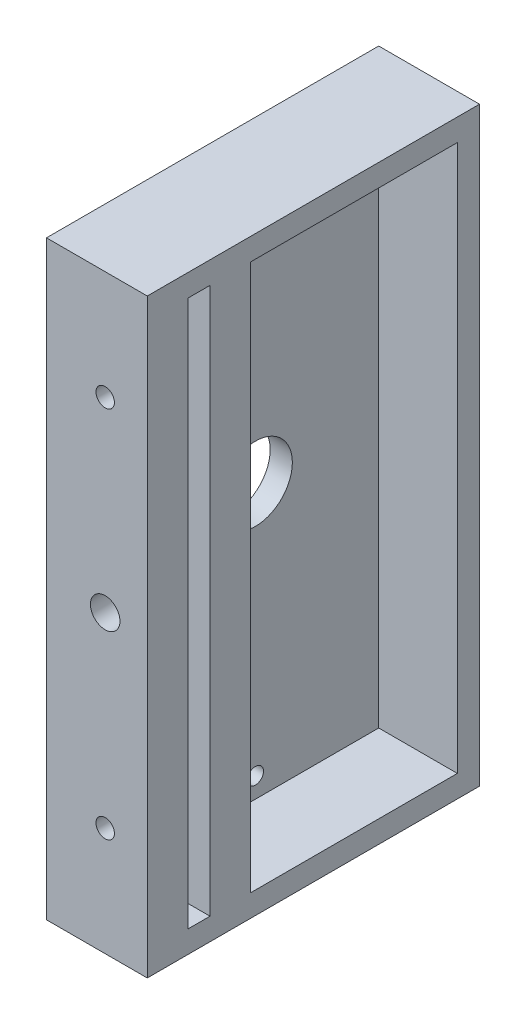
ISO-10303-21;
HEADER;
FILE_DESCRIPTION(('STEP AP214'),'2;1');
FILE_NAME('part.step','',(''),(''),'','','');
FILE_SCHEMA(('AUTOMOTIVE_DESIGN { 1 0 10303 214 1 1 1 1 }'));
ENDSEC;
DATA;
#1=APPLICATION_CONTEXT('core data for automotive mechanical design processes');
#2=APPLICATION_PROTOCOL_DEFINITION('international standard','automotive_design',2000,#1);
#3=PRODUCT_CONTEXT('',#1,'mechanical');
#4=PRODUCT('Part','Part','',(#3));
#5=PRODUCT_RELATED_PRODUCT_CATEGORY('part','',(#4));
#6=PRODUCT_DEFINITION_FORMATION('','',#4);
#7=PRODUCT_DEFINITION_CONTEXT('part definition',#1,'design');
#8=PRODUCT_DEFINITION('design','',#6,#7);
#9=PRODUCT_DEFINITION_SHAPE('','',#8);
#10=(LENGTH_UNIT() NAMED_UNIT(*) SI_UNIT(.MILLI.,.METRE.));
#11=(NAMED_UNIT(*) PLANE_ANGLE_UNIT() SI_UNIT($,.RADIAN.));
#12=(NAMED_UNIT(*) SI_UNIT($,.STERADIAN.) SOLID_ANGLE_UNIT());
#13=UNCERTAINTY_MEASURE_WITH_UNIT(LENGTH_MEASURE(1.E-05),#10,'distance_accuracy_value','');
#14=(GEOMETRIC_REPRESENTATION_CONTEXT(3) GLOBAL_UNCERTAINTY_ASSIGNED_CONTEXT((#13)) GLOBAL_UNIT_ASSIGNED_CONTEXT((#10,
#11,#12)) REPRESENTATION_CONTEXT('',''));
#15=CARTESIAN_POINT('',(0.,0.,0.));
#16=DIRECTION('',(0.,0.,1.));
#17=DIRECTION('',(1.,0.,0.));
#18=AXIS2_PLACEMENT_3D('',#15,#16,#17);
#19=CARTESIAN_POINT('',(0.,80.,9.50197166325664));
#20=DIRECTION('',(0.,0.,-1.));
#21=DIRECTION('',(-1.,0.,0.));
#22=AXIS2_PLACEMENT_3D('',#19,#20,#21);
#23=PLANE('',#22);
#24=CARTESIAN_POINT('',(7.66040087296786,65.2737580008136,9.50197166325664));
#25=DIRECTION('',(0.,0.,-1.));
#26=DIRECTION('',(-1.,0.,0.));
#27=AXIS2_PLACEMENT_3D('',#24,#25,#26);
#28=CIRCLE('',#27,1.25);
#29=CARTESIAN_POINT('',(6.41040087296786,65.2737580008136,9.50197166325664));
#30=VERTEX_POINT('',#29);
#31=EDGE_CURVE('E211',#30,#30,#28,.T.);
#32=ORIENTED_EDGE('',*,*,#31,.T.);
#33=EDGE_LOOP('',(#32));
#34=FACE_BOUND('',#33,.T.);
#35=CARTESIAN_POINT('',(7.66040087296786,40.,9.50197166325664));
#36=DIRECTION('',(0.,0.,-1.));
#37=DIRECTION('',(-1.,0.,0.));
#38=AXIS2_PLACEMENT_3D('',#35,#36,#37);
#39=CIRCLE('',#38,2.);
#40=CARTESIAN_POINT('',(5.66040087296786,40.,9.50197166325664));
#41=VERTEX_POINT('',#40);
#42=EDGE_CURVE('E197',#41,#41,#39,.T.);
#43=ORIENTED_EDGE('',*,*,#42,.T.);
#44=EDGE_LOOP('',(#43));
#45=FACE_BOUND('',#44,.T.);
#46=CARTESIAN_POINT('',(7.66040087296786,14.7262419991864,9.50197166325664));
#47=DIRECTION('',(0.,0.,-1.));
#48=DIRECTION('',(-1.,0.,0.));
#49=AXIS2_PLACEMENT_3D('',#46,#47,#48);
#50=CIRCLE('',#49,1.25);
#51=CARTESIAN_POINT('',(6.41040087296786,14.7262419991864,9.50197166325664));
#52=VERTEX_POINT('',#51);
#53=EDGE_CURVE('E201',#52,#52,#50,.T.);
#54=ORIENTED_EDGE('',*,*,#53,.T.);
#55=EDGE_LOOP('',(#54));
#56=FACE_BOUND('',#55,.T.);
#57=DIRECTION('',(-1.,0.,0.));
#58=VECTOR('',#57,1.);
#59=CARTESIAN_POINT('',(0.,3.,9.50197166325664));
#60=LINE('',#59,#58);
#61=CARTESIAN_POINT('',(13.3604008729679,3.,9.50197166325664));
#62=VERTEX_POINT('',#61);
#63=CARTESIAN_POINT('',(2.71072157317264,3.,9.50197166325664));
#64=VERTEX_POINT('',#63);
#65=EDGE_CURVE('E171',#62,#64,#60,.T.);
#66=ORIENTED_EDGE('',*,*,#65,.F.);
#67=DIRECTION('',(0.,-1.,0.));
#68=VECTOR('',#67,1.);
#69=CARTESIAN_POINT('',(13.3604008729679,80.,9.50197166325664));
#70=LINE('',#69,#68);
#71=CARTESIAN_POINT('',(13.3604008729679,77.,9.50197166325664));
#72=VERTEX_POINT('',#71);
#73=EDGE_CURVE('E11',#72,#62,#70,.T.);
#74=ORIENTED_EDGE('',*,*,#73,.F.);
#75=DIRECTION('',(-1.,0.,0.));
#76=VECTOR('',#75,1.);
#77=CARTESIAN_POINT('',(0.,77.,9.50197166325664));
#78=LINE('',#77,#76);
#79=CARTESIAN_POINT('',(2.71072157317264,77.,9.50197166325664));
#80=VERTEX_POINT('',#79);
#81=EDGE_CURVE('E165',#72,#80,#78,.T.);
#82=ORIENTED_EDGE('',*,*,#81,.T.);
#83=DIRECTION('',(0.,-1.,0.));
#84=VECTOR('',#83,1.);
#85=CARTESIAN_POINT('',(2.71072157317264,80.,9.50197166325664));
#86=LINE('',#85,#84);
#87=EDGE_CURVE('E226',#80,#64,#86,.T.);
#88=ORIENTED_EDGE('',*,*,#87,.T.);
#89=EDGE_LOOP('',(#66,#74,#82,#88));
#90=FACE_BOUND('',#89,.T.);
#91=ADVANCED_FACE('F34',(#34,#45,#56,#90),#23,.F.);
#92=CARTESIAN_POINT('',(0.,80.,4.00197166325664));
#93=DIRECTION('',(0.,0.,-1.));
#94=DIRECTION('',(-1.,0.,0.));
#95=AXIS2_PLACEMENT_3D('',#92,#93,#94);
#96=PLANE('',#95);
#97=CARTESIAN_POINT('',(7.66040087296786,14.7262419991864,4.00197166325664));
#98=DIRECTION('',(0.,0.,-1.));
#99=DIRECTION('',(1.,0.,0.));
#100=AXIS2_PLACEMENT_3D('',#97,#98,#99);
#101=CIRCLE('',#100,1.25);
#102=CARTESIAN_POINT('',(8.91040087296787,14.7262419991864,4.00197166325664));
#103=VERTEX_POINT('',#102);
#104=EDGE_CURVE('E188',#103,#103,#101,.T.);
#105=ORIENTED_EDGE('',*,*,#104,.F.);
#106=EDGE_LOOP('',(#105));
#107=FACE_BOUND('',#106,.T.);
#108=CARTESIAN_POINT('',(7.66040087296786,40.,4.00197166325664));
#109=DIRECTION('',(0.,0.,-1.));
#110=DIRECTION('',(-1.,0.,0.));
#111=AXIS2_PLACEMENT_3D('',#108,#109,#110);
#112=CIRCLE('',#111,2.);
#113=CARTESIAN_POINT('',(5.66040087296786,40.,4.00197166325664));
#114=VERTEX_POINT('',#113);
#115=EDGE_CURVE('E194',#114,#114,#112,.T.);
#116=ORIENTED_EDGE('',*,*,#115,.F.);
#117=EDGE_LOOP('',(#116));
#118=FACE_BOUND('',#117,.T.);
#119=CARTESIAN_POINT('',(7.66040087296786,65.2737580008136,4.00197166325664));
#120=DIRECTION('',(0.,0.,-1.));
#121=DIRECTION('',(-1.,0.,0.));
#122=AXIS2_PLACEMENT_3D('',#119,#120,#121);
#123=CIRCLE('',#122,1.25);
#124=CARTESIAN_POINT('',(6.41040087296786,65.2737580008136,4.00197166325664));
#125=VERTEX_POINT('',#124);
#126=EDGE_CURVE('E204',#125,#125,#123,.T.);
#127=ORIENTED_EDGE('',*,*,#126,.F.);
#128=EDGE_LOOP('',(#127));
#129=FACE_BOUND('',#128,.T.);
#130=DIRECTION('',(0.,-1.,0.));
#131=VECTOR('',#130,1.);
#132=CARTESIAN_POINT('',(13.3604008729679,80.,4.00197166325664));
#133=LINE('',#132,#131);
#134=CARTESIAN_POINT('',(13.3604008729679,77.,4.00197166325664));
#135=VERTEX_POINT('',#134);
#136=CARTESIAN_POINT('',(13.3604008729679,3.,4.00197166325664));
#137=VERTEX_POINT('',#136);
#138=EDGE_CURVE('E42',#135,#137,#133,.T.);
#139=ORIENTED_EDGE('',*,*,#138,.T.);
#140=DIRECTION('',(-1.,0.,0.));
#141=VECTOR('',#140,1.);
#142=CARTESIAN_POINT('',(0.,3.,4.00197166325664));
#143=LINE('',#142,#141);
#144=CARTESIAN_POINT('',(2.71072157317264,3.,4.00197166325664));
#145=VERTEX_POINT('',#144);
#146=EDGE_CURVE('E168',#137,#145,#143,.T.);
#147=ORIENTED_EDGE('',*,*,#146,.T.);
#148=DIRECTION('',(0.,-1.,0.));
#149=VECTOR('',#148,1.);
#150=CARTESIAN_POINT('',(2.71072157317264,80.,4.00197166325664));
#151=LINE('',#150,#149);
#152=CARTESIAN_POINT('',(2.71072157317264,77.,4.00197166325664));
#153=VERTEX_POINT('',#152);
#154=EDGE_CURVE('E249',#153,#145,#151,.T.);
#155=ORIENTED_EDGE('',*,*,#154,.F.);
#156=DIRECTION('',(-1.,0.,0.));
#157=VECTOR('',#156,1.);
#158=CARTESIAN_POINT('',(0.,77.,4.00197166325664));
#159=LINE('',#158,#157);
#160=EDGE_CURVE('E142',#135,#153,#159,.T.);
#161=ORIENTED_EDGE('',*,*,#160,.F.);
#162=EDGE_LOOP('',(#139,#147,#155,#161));
#163=FACE_BOUND('',#162,.T.);
#164=ADVANCED_FACE('F286',(#107,#118,#129,#163),#96,.T.);
#165=CARTESIAN_POINT('',(2.71072157317264,80.,0.));
#166=DIRECTION('',(1.,0.,0.));
#167=DIRECTION('',(0.,0.,-1.));
#168=AXIS2_PLACEMENT_3D('',#165,#166,#167);
#169=PLANE('',#168);
#170=CARTESIAN_POINT('',(2.71072157317264,74.25,-7.29802833674336));
#171=DIRECTION('',(1.,0.,0.));
#172=DIRECTION('',(0.,0.,-1.));
#173=AXIS2_PLACEMENT_3D('',#170,#171,#172);
#174=CIRCLE('',#173,1.0922);
#175=CARTESIAN_POINT('',(2.71072157317264,74.25,-8.39022833674336));
#176=VERTEX_POINT('',#175);
#177=EDGE_CURVE('E174',#176,#176,#174,.T.);
#178=ORIENTED_EDGE('',*,*,#177,.F.);
#179=EDGE_LOOP('',(#178));
#180=FACE_BOUND('',#179,.T.);
#181=CARTESIAN_POINT('',(2.71072157317264,5.74999999999999,-7.29802833674336));
#182=DIRECTION('',(1.,0.,0.));
#183=DIRECTION('',(0.,0.,1.));
#184=AXIS2_PLACEMENT_3D('',#181,#182,#183);
#185=CIRCLE('',#184,1.0922);
#186=CARTESIAN_POINT('',(2.71072157317264,5.74999999999999,-6.20582833674336));
#187=VERTEX_POINT('',#186);
#188=EDGE_CURVE('E173',#187,#187,#185,.T.);
#189=ORIENTED_EDGE('',*,*,#188,.F.);
#190=EDGE_LOOP('',(#189));
#191=FACE_BOUND('',#190,.T.);
#192=CARTESIAN_POINT('',(2.71072157317264,40.,-7.29802833674336));
#193=DIRECTION('',(1.,0.,0.));
#194=DIRECTION('',(0.,0.,-1.));
#195=AXIS2_PLACEMENT_3D('',#192,#193,#194);
#196=CIRCLE('',#195,5.);
#197=CARTESIAN_POINT('',(2.71072157317264,40.,-12.2980283367434));
#198=VERTEX_POINT('',#197);
#199=EDGE_CURVE('E180',#198,#198,#196,.T.);
#200=ORIENTED_EDGE('',*,*,#199,.F.);
#201=EDGE_LOOP('',(#200));
#202=FACE_BOUND('',#201,.T.);
#203=ORIENTED_EDGE('',*,*,#154,.T.);
#204=DIRECTION('',(0.,0.,1.));
#205=VECTOR('',#204,1.);
#206=CARTESIAN_POINT('',(2.71072157317264,3.,0.));
#207=LINE('',#206,#205);
#208=CARTESIAN_POINT('',(2.71072157317264,3.,-23.9980283367434));
#209=VERTEX_POINT('',#208);
#210=EDGE_CURVE('E149',#209,#145,#207,.T.);
#211=ORIENTED_EDGE('',*,*,#210,.F.);
#212=DIRECTION('',(0.,-1.,0.));
#213=VECTOR('',#212,1.);
#214=CARTESIAN_POINT('',(2.71072157317264,0.,-23.9980283367434));
#215=LINE('',#214,#213);
#216=CARTESIAN_POINT('',(2.71072157317264,77.,-23.9980283367434));
#217=VERTEX_POINT('',#216);
#218=EDGE_CURVE('E131',#217,#209,#215,.T.);
#219=ORIENTED_EDGE('',*,*,#218,.F.);
#220=DIRECTION('',(0.,0.,1.));
#221=VECTOR('',#220,1.);
#222=CARTESIAN_POINT('',(2.71072157317264,77.,0.));
#223=LINE('',#222,#221);
#224=EDGE_CURVE('E139',#217,#153,#223,.T.);
#225=ORIENTED_EDGE('',*,*,#224,.T.);
#226=EDGE_LOOP('',(#203,#211,#219,#225));
#227=FACE_BOUND('',#226,.T.);
#228=ADVANCED_FACE('F148',(#180,#191,#202,#227),#169,.T.);
#229=CARTESIAN_POINT('',(0.,80.,12.5019716632566));
#230=DIRECTION('',(0.,0.,-1.));
#231=DIRECTION('',(-1.,0.,0.));
#232=AXIS2_PLACEMENT_3D('',#229,#230,#231);
#233=PLANE('',#232);
#234=CARTESIAN_POINT('',(7.66040087296786,14.7262419991864,12.5019716632566));
#235=DIRECTION('',(0.,0.,-1.));
#236=DIRECTION('',(-1.,0.,0.));
#237=AXIS2_PLACEMENT_3D('',#234,#235,#236);
#238=CIRCLE('',#237,1.25);
#239=CARTESIAN_POINT('',(6.41040087296786,14.7262419991864,12.5019716632566));
#240=VERTEX_POINT('',#239);
#241=EDGE_CURVE('E200',#240,#240,#238,.T.);
#242=ORIENTED_EDGE('',*,*,#241,.F.);
#243=EDGE_LOOP('',(#242));
#244=FACE_BOUND('',#243,.T.);
#245=CARTESIAN_POINT('',(7.66040087296786,40.,12.5019716632566));
#246=DIRECTION('',(0.,0.,-1.));
#247=DIRECTION('',(-1.,0.,0.));
#248=AXIS2_PLACEMENT_3D('',#245,#246,#247);
#249=CIRCLE('',#248,2.);
#250=CARTESIAN_POINT('',(5.66040087296786,40.,12.5019716632566));
#251=VERTEX_POINT('',#250);
#252=EDGE_CURVE('E187',#251,#251,#249,.T.);
#253=ORIENTED_EDGE('',*,*,#252,.F.);
#254=EDGE_LOOP('',(#253));
#255=FACE_BOUND('',#254,.T.);
#256=CARTESIAN_POINT('',(7.66040087296786,65.2737580008136,12.5019716632566));
#257=DIRECTION('',(0.,0.,-1.));
#258=DIRECTION('',(-1.,0.,0.));
#259=AXIS2_PLACEMENT_3D('',#256,#257,#258);
#260=CIRCLE('',#259,1.25);
#261=CARTESIAN_POINT('',(6.41040087296786,65.2737580008136,12.5019716632566));
#262=VERTEX_POINT('',#261);
#263=EDGE_CURVE('E208',#262,#262,#260,.T.);
#264=ORIENTED_EDGE('',*,*,#263,.F.);
#265=EDGE_LOOP('',(#264));
#266=FACE_BOUND('',#265,.T.);
#267=DIRECTION('',(0.,-1.,0.));
#268=VECTOR('',#267,1.);
#269=CARTESIAN_POINT('',(13.3604008729679,80.,12.5019716632566));
#270=LINE('',#269,#268);
#271=CARTESIAN_POINT('',(13.3604008729679,77.,12.5019716632566));
#272=VERTEX_POINT('',#271);
#273=CARTESIAN_POINT('',(13.3604008729679,3.,12.5019716632566));
#274=VERTEX_POINT('',#273);
#275=EDGE_CURVE('E239',#272,#274,#270,.T.);
#276=ORIENTED_EDGE('',*,*,#275,.T.);
#277=DIRECTION('',(-1.,0.,0.));
#278=VECTOR('',#277,1.);
#279=CARTESIAN_POINT('',(102.580634004248,3.,12.5019716632566));
#280=LINE('',#279,#278);
#281=CARTESIAN_POINT('',(2.71072157317264,3.,12.5019716632566));
#282=VERTEX_POINT('',#281);
#283=EDGE_CURVE('E155',#274,#282,#280,.T.);
#284=ORIENTED_EDGE('',*,*,#283,.T.);
#285=DIRECTION('',(0.,-1.,0.));
#286=VECTOR('',#285,1.);
#287=CARTESIAN_POINT('',(2.71072157317264,80.,12.5019716632566));
#288=LINE('',#287,#286);
#289=CARTESIAN_POINT('',(2.71072157317264,77.,12.5019716632566));
#290=VERTEX_POINT('',#289);
#291=EDGE_CURVE('E236',#290,#282,#288,.T.);
#292=ORIENTED_EDGE('',*,*,#291,.F.);
#293=DIRECTION('',(-1.,0.,0.));
#294=VECTOR('',#293,1.);
#295=CARTESIAN_POINT('',(102.580634004248,77.,12.5019716632566));
#296=LINE('',#295,#294);
#297=EDGE_CURVE('E56',#272,#290,#296,.T.);
#298=ORIENTED_EDGE('',*,*,#297,.F.);
#299=EDGE_LOOP('',(#276,#284,#292,#298));
#300=FACE_BOUND('',#299,.T.);
#301=ADVANCED_FACE('F336',(#244,#255,#266,#300),#233,.T.);
#302=ORIENTED_EDGE('',*,*,#291,.T.);
#303=EDGE_CURVE('E150',#64,#282,#207,.T.);
#304=ORIENTED_EDGE('',*,*,#303,.F.);
#305=ORIENTED_EDGE('',*,*,#87,.F.);
#306=EDGE_CURVE('E146',#80,#290,#223,.T.);
#307=ORIENTED_EDGE('',*,*,#306,.T.);
#308=EDGE_LOOP('',(#302,#304,#305,#307));
#309=FACE_BOUND('',#308,.T.);
#310=ADVANCED_FACE('F332',(#309),#169,.T.);
#311=CARTESIAN_POINT('',(0.,80.,-26.9980283367434));
#312=DIRECTION('',(0.,0.,-1.));
#313=DIRECTION('',(-1.,0.,0.));
#314=AXIS2_PLACEMENT_3D('',#311,#312,#313);
#315=PLANE('',#314);
#316=DIRECTION('',(1.,0.,0.));
#317=VECTOR('',#316,1.);
#318=CARTESIAN_POINT('',(0.,0.,-26.9980283367434));
#319=LINE('',#318,#317);
#320=CARTESIAN_POINT('',(-0.289278426827365,0.,-26.9980283367434));
#321=VERTEX_POINT('',#320);
#322=CARTESIAN_POINT('',(13.3604008729679,0.,-26.9980283367434));
#323=VERTEX_POINT('',#322);
#324=EDGE_CURVE('E214',#321,#323,#319,.T.);
#325=ORIENTED_EDGE('',*,*,#324,.F.);
#326=DIRECTION('',(0.,-1.,0.));
#327=VECTOR('',#326,1.);
#328=CARTESIAN_POINT('',(-0.289278426827365,80.,-26.9980283367434));
#329=LINE('',#328,#327);
#330=CARTESIAN_POINT('',(-0.289278426827365,80.,-26.9980283367434));
#331=VERTEX_POINT('',#330);
#332=EDGE_CURVE('E247',#331,#321,#329,.T.);
#333=ORIENTED_EDGE('',*,*,#332,.F.);
#334=DIRECTION('',(1.,0.,0.));
#335=VECTOR('',#334,1.);
#336=CARTESIAN_POINT('',(0.,80.,-26.9980283367434));
#337=LINE('',#336,#335);
#338=CARTESIAN_POINT('',(13.3604008729679,80.,-26.9980283367434));
#339=VERTEX_POINT('',#338);
#340=EDGE_CURVE('E218',#331,#339,#337,.T.);
#341=ORIENTED_EDGE('',*,*,#340,.T.);
#342=DIRECTION('',(0.,-1.,0.));
#343=VECTOR('',#342,1.);
#344=CARTESIAN_POINT('',(13.3604008729679,0.,-26.9980283367434));
#345=LINE('',#344,#343);
#346=EDGE_CURVE('E160',#339,#323,#345,.T.);
#347=ORIENTED_EDGE('',*,*,#346,.T.);
#348=EDGE_LOOP('',(#325,#333,#341,#347));
#349=FACE_BOUND('',#348,.T.);
#350=ADVANCED_FACE('F329',(#349),#315,.T.);
#351=CARTESIAN_POINT('',(-0.289278426827362,80.,0.));
#352=DIRECTION('',(1.,0.,0.));
#353=DIRECTION('',(0.,0.,-1.));
#354=AXIS2_PLACEMENT_3D('',#351,#352,#353);
#355=PLANE('',#354);
#356=CARTESIAN_POINT('',(-0.289278426827363,74.25,-7.29802833674336));
#357=DIRECTION('',(1.,0.,0.));
#358=DIRECTION('',(0.,0.,-1.));
#359=AXIS2_PLACEMENT_3D('',#356,#357,#358);
#360=CIRCLE('',#359,1.0922);
#361=CARTESIAN_POINT('',(-0.289278426827363,74.25,-8.39022833674336));
#362=VERTEX_POINT('',#361);
#363=EDGE_CURVE('E37',#362,#362,#360,.T.);
#364=ORIENTED_EDGE('',*,*,#363,.T.);
#365=EDGE_LOOP('',(#364));
#366=FACE_BOUND('',#365,.T.);
#367=CARTESIAN_POINT('',(-0.289278426827363,5.74999999999999,-7.29802833674336));
#368=DIRECTION('',(1.,0.,0.));
#369=DIRECTION('',(0.,0.,-1.));
#370=AXIS2_PLACEMENT_3D('',#367,#368,#369);
#371=CIRCLE('',#370,1.0922);
#372=CARTESIAN_POINT('',(-0.289278426827363,5.74999999999999,-8.39022833674336));
#373=VERTEX_POINT('',#372);
#374=EDGE_CURVE('E177',#373,#373,#371,.T.);
#375=ORIENTED_EDGE('',*,*,#374,.T.);
#376=EDGE_LOOP('',(#375));
#377=FACE_BOUND('',#376,.T.);
#378=CARTESIAN_POINT('',(-0.289278426827363,40.,-7.29802833674336));
#379=DIRECTION('',(1.,0.,0.));
#380=DIRECTION('',(0.,0.,-1.));
#381=AXIS2_PLACEMENT_3D('',#378,#379,#380);
#382=CIRCLE('',#381,5.);
#383=CARTESIAN_POINT('',(-0.289278426827364,40.,-12.2980283367434));
#384=VERTEX_POINT('',#383);
#385=EDGE_CURVE('E183',#384,#384,#382,.T.);
#386=ORIENTED_EDGE('',*,*,#385,.T.);
#387=EDGE_LOOP('',(#386));
#388=FACE_BOUND('',#387,.T.);
#389=DIRECTION('',(0.,0.,1.));
#390=VECTOR('',#389,1.);
#391=CARTESIAN_POINT('',(-0.289278426827362,0.,0.));
#392=LINE('',#391,#390);
#393=CARTESIAN_POINT('',(-0.289278426827359,0.,18.0019716632566));
#394=VERTEX_POINT('',#393);
#395=EDGE_CURVE('E228',#321,#394,#392,.T.);
#396=ORIENTED_EDGE('',*,*,#395,.T.);
#397=DIRECTION('',(0.,-1.,0.));
#398=VECTOR('',#397,1.);
#399=CARTESIAN_POINT('',(-0.289278426827359,80.,18.0019716632566));
#400=LINE('',#399,#398);
#401=CARTESIAN_POINT('',(-0.289278426827359,80.,18.0019716632566));
#402=VERTEX_POINT('',#401);
#403=EDGE_CURVE('E244',#402,#394,#400,.T.);
#404=ORIENTED_EDGE('',*,*,#403,.F.);
#405=DIRECTION('',(0.,0.,1.));
#406=VECTOR('',#405,1.);
#407=CARTESIAN_POINT('',(-0.289278426827362,80.,0.));
#408=LINE('',#407,#406);
#409=EDGE_CURVE('E221',#331,#402,#408,.T.);
#410=ORIENTED_EDGE('',*,*,#409,.F.);
#411=ORIENTED_EDGE('',*,*,#332,.T.);
#412=EDGE_LOOP('',(#396,#404,#410,#411));
#413=FACE_BOUND('',#412,.T.);
#414=ADVANCED_FACE('F266',(#366,#377,#388,#413),#355,.F.);
#415=CARTESIAN_POINT('',(0.,80.,18.0019716632566));
#416=DIRECTION('',(0.,0.,-1.));
#417=DIRECTION('',(-1.,0.,0.));
#418=AXIS2_PLACEMENT_3D('',#415,#416,#417);
#419=PLANE('',#418);
#420=CARTESIAN_POINT('',(7.66040087296786,14.7262419991864,18.0019716632566));
#421=DIRECTION('',(0.,0.,-1.));
#422=DIRECTION('',(1.,0.,0.));
#423=AXIS2_PLACEMENT_3D('',#420,#421,#422);
#424=CIRCLE('',#423,1.25);
#425=CARTESIAN_POINT('',(8.91040087296787,14.7262419991864,18.0019716632566));
#426=VERTEX_POINT('',#425);
#427=EDGE_CURVE('E184',#426,#426,#424,.T.);
#428=ORIENTED_EDGE('',*,*,#427,.T.);
#429=EDGE_LOOP('',(#428));
#430=FACE_BOUND('',#429,.T.);
#431=CARTESIAN_POINT('',(7.66040087296786,40.,18.0019716632566));
#432=DIRECTION('',(0.,0.,-1.));
#433=DIRECTION('',(-1.,0.,0.));
#434=AXIS2_PLACEMENT_3D('',#431,#432,#433);
#435=CIRCLE('',#434,2.);
#436=CARTESIAN_POINT('',(5.66040087296786,40.,18.0019716632566));
#437=VERTEX_POINT('',#436);
#438=EDGE_CURVE('E191',#437,#437,#435,.T.);
#439=ORIENTED_EDGE('',*,*,#438,.T.);
#440=EDGE_LOOP('',(#439));
#441=FACE_BOUND('',#440,.T.);
#442=CARTESIAN_POINT('',(7.66040087296786,65.2737580008136,18.0019716632566));
#443=DIRECTION('',(0.,0.,-1.));
#444=DIRECTION('',(-1.,0.,0.));
#445=AXIS2_PLACEMENT_3D('',#442,#443,#444);
#446=CIRCLE('',#445,1.25);
#447=CARTESIAN_POINT('',(6.41040087296786,65.2737580008136,18.0019716632566));
#448=VERTEX_POINT('',#447);
#449=EDGE_CURVE('E205',#448,#448,#446,.T.);
#450=ORIENTED_EDGE('',*,*,#449,.T.);
#451=EDGE_LOOP('',(#450));
#452=FACE_BOUND('',#451,.T.);
#453=DIRECTION('',(1.,0.,0.));
#454=VECTOR('',#453,1.);
#455=CARTESIAN_POINT('',(0.,0.,18.0019716632566));
#456=LINE('',#455,#454);
#457=CARTESIAN_POINT('',(13.3604008729679,0.,18.0019716632566));
#458=VERTEX_POINT('',#457);
#459=EDGE_CURVE('E230',#394,#458,#456,.T.);
#460=ORIENTED_EDGE('',*,*,#459,.T.);
#461=DIRECTION('',(0.,-1.,0.));
#462=VECTOR('',#461,1.);
#463=CARTESIAN_POINT('',(13.3604008729679,80.,18.0019716632566));
#464=LINE('',#463,#462);
#465=CARTESIAN_POINT('',(13.3604008729679,80.,18.0019716632566));
#466=VERTEX_POINT('',#465);
#467=EDGE_CURVE('E241',#466,#458,#464,.T.);
#468=ORIENTED_EDGE('',*,*,#467,.F.);
#469=DIRECTION('',(1.,0.,0.));
#470=VECTOR('',#469,1.);
#471=CARTESIAN_POINT('',(0.,80.,18.0019716632566));
#472=LINE('',#471,#470);
#473=EDGE_CURVE('E223',#402,#466,#472,.T.);
#474=ORIENTED_EDGE('',*,*,#473,.F.);
#475=ORIENTED_EDGE('',*,*,#403,.T.);
#476=EDGE_LOOP('',(#460,#468,#474,#475));
#477=FACE_BOUND('',#476,.T.);
#478=ADVANCED_FACE('F318',(#430,#441,#452,#477),#419,.F.);
#479=CARTESIAN_POINT('',(13.3604008729679,80.,0.));
#480=DIRECTION('',(-1.,0.,0.));
#481=DIRECTION('',(0.,0.,1.));
#482=AXIS2_PLACEMENT_3D('',#479,#480,#481);
#483=PLANE('',#482);
#484=ORIENTED_EDGE('',*,*,#73,.T.);
#485=DIRECTION('',(0.,0.,-1.));
#486=VECTOR('',#485,1.);
#487=CARTESIAN_POINT('',(13.3604008729679,3.,0.));
#488=LINE('',#487,#486);
#489=EDGE_CURVE('E304',#274,#62,#488,.T.);
#490=ORIENTED_EDGE('',*,*,#489,.F.);
#491=ORIENTED_EDGE('',*,*,#275,.F.);
#492=DIRECTION('',(0.,0.,-1.));
#493=VECTOR('',#492,1.);
#494=CARTESIAN_POINT('',(13.3604008729679,77.,0.));
#495=LINE('',#494,#493);
#496=EDGE_CURVE('E166',#272,#72,#495,.T.);
#497=ORIENTED_EDGE('',*,*,#496,.T.);
#498=EDGE_LOOP('',(#484,#490,#491,#497));
#499=FACE_BOUND('',#498,.T.);
#500=DIRECTION('',(0.,0.,-1.));
#501=VECTOR('',#500,1.);
#502=CARTESIAN_POINT('',(13.3604008729679,0.,0.));
#503=LINE('',#502,#501);
#504=EDGE_CURVE('E219',#458,#323,#503,.T.);
#505=ORIENTED_EDGE('',*,*,#504,.T.);
#506=ORIENTED_EDGE('',*,*,#346,.F.);
#507=DIRECTION('',(0.,0.,-1.));
#508=VECTOR('',#507,1.);
#509=CARTESIAN_POINT('',(13.3604008729679,80.,0.));
#510=LINE('',#509,#508);
#511=EDGE_CURVE('E215',#466,#339,#510,.T.);
#512=ORIENTED_EDGE('',*,*,#511,.F.);
#513=ORIENTED_EDGE('',*,*,#467,.T.);
#514=EDGE_LOOP('',(#505,#506,#512,#513));
#515=FACE_BOUND('',#514,.T.);
#516=CARTESIAN_POINT('',(13.3604008729679,3.,-23.9980283367434));
#517=VERTEX_POINT('',#516);
#518=EDGE_CURVE('E163',#137,#517,#488,.T.);
#519=ORIENTED_EDGE('',*,*,#518,.F.);
#520=ORIENTED_EDGE('',*,*,#138,.F.);
#521=CARTESIAN_POINT('',(13.3604008729679,77.,-23.9980283367434));
#522=VERTEX_POINT('',#521);
#523=EDGE_CURVE('E308',#135,#522,#495,.T.);
#524=ORIENTED_EDGE('',*,*,#523,.T.);
#525=DIRECTION('',(0.,1.,0.));
#526=VECTOR('',#525,1.);
#527=CARTESIAN_POINT('',(13.3604008729679,0.,-23.9980283367434));
#528=LINE('',#527,#526);
#529=EDGE_CURVE('E134',#517,#522,#528,.T.);
#530=ORIENTED_EDGE('',*,*,#529,.F.);
#531=EDGE_LOOP('',(#519,#520,#524,#530));
#532=FACE_BOUND('',#531,.T.);
#533=ADVANCED_FACE('F302',(#499,#515,#532),#483,.F.);
#534=CARTESIAN_POINT('',(0.,80.,0.));
#535=DIRECTION('',(0.,1.,0.));
#536=DIRECTION('',(0.,0.,1.));
#537=AXIS2_PLACEMENT_3D('',#534,#535,#536);
#538=PLANE('',#537);
#539=ORIENTED_EDGE('',*,*,#473,.T.);
#540=ORIENTED_EDGE('',*,*,#511,.T.);
#541=ORIENTED_EDGE('',*,*,#340,.F.);
#542=ORIENTED_EDGE('',*,*,#409,.T.);
#543=EDGE_LOOP('',(#539,#540,#541,#542));
#544=FACE_BOUND('',#543,.T.);
#545=ADVANCED_FACE('F317',(#544),#538,.T.);
#546=CARTESIAN_POINT('',(0.,0.,0.));
#547=DIRECTION('',(0.,1.,0.));
#548=DIRECTION('',(0.,0.,1.));
#549=AXIS2_PLACEMENT_3D('',#546,#547,#548);
#550=PLANE('',#549);
#551=ORIENTED_EDGE('',*,*,#324,.T.);
#552=ORIENTED_EDGE('',*,*,#504,.F.);
#553=ORIENTED_EDGE('',*,*,#459,.F.);
#554=ORIENTED_EDGE('',*,*,#395,.F.);
#555=EDGE_LOOP('',(#551,#552,#553,#554));
#556=FACE_BOUND('',#555,.T.);
#557=ADVANCED_FACE('F323',(#556),#550,.F.);
#558=CARTESIAN_POINT('',(7.66040087296786,65.2737580008136,18.0019716632566));
#559=DIRECTION('',(0.,0.,-1.));
#560=DIRECTION('',(-1.,0.,0.));
#561=AXIS2_PLACEMENT_3D('',#558,#559,#560);
#562=CYLINDRICAL_SURFACE('',#561,1.25);
#563=ORIENTED_EDGE('',*,*,#263,.T.);
#564=EDGE_LOOP('',(#563));
#565=FACE_BOUND('',#564,.T.);
#566=ORIENTED_EDGE('',*,*,#449,.F.);
#567=EDGE_LOOP('',(#566));
#568=FACE_BOUND('',#567,.T.);
#569=ADVANCED_FACE('F344',(#565,#568),#562,.F.);
#570=ORIENTED_EDGE('',*,*,#126,.T.);
#571=EDGE_LOOP('',(#570));
#572=FACE_BOUND('',#571,.T.);
#573=ORIENTED_EDGE('',*,*,#31,.F.);
#574=EDGE_LOOP('',(#573));
#575=FACE_BOUND('',#574,.T.);
#576=ADVANCED_FACE('F349',(#572,#575),#562,.F.);
#577=CARTESIAN_POINT('',(7.66040087296786,40.,18.0019716632566));
#578=DIRECTION('',(0.,0.,-1.));
#579=DIRECTION('',(-1.,0.,0.));
#580=AXIS2_PLACEMENT_3D('',#577,#578,#579);
#581=CYLINDRICAL_SURFACE('',#580,2.);
#582=ORIENTED_EDGE('',*,*,#252,.T.);
#583=EDGE_LOOP('',(#582));
#584=FACE_BOUND('',#583,.T.);
#585=ORIENTED_EDGE('',*,*,#438,.F.);
#586=EDGE_LOOP('',(#585));
#587=FACE_BOUND('',#586,.T.);
#588=ADVANCED_FACE('F351',(#584,#587),#581,.F.);
#589=CARTESIAN_POINT('',(7.66040087296786,14.7262419991864,18.0019716632566));
#590=DIRECTION('',(0.,0.,-1.));
#591=DIRECTION('',(-1.,0.,0.));
#592=AXIS2_PLACEMENT_3D('',#589,#590,#591);
#593=CYLINDRICAL_SURFACE('',#592,1.25);
#594=ORIENTED_EDGE('',*,*,#241,.T.);
#595=EDGE_LOOP('',(#594));
#596=FACE_BOUND('',#595,.T.);
#597=ORIENTED_EDGE('',*,*,#427,.F.);
#598=EDGE_LOOP('',(#597));
#599=FACE_BOUND('',#598,.T.);
#600=ADVANCED_FACE('F354',(#596,#599),#593,.F.);
#601=ORIENTED_EDGE('',*,*,#115,.T.);
#602=EDGE_LOOP('',(#601));
#603=FACE_BOUND('',#602,.T.);
#604=ORIENTED_EDGE('',*,*,#42,.F.);
#605=EDGE_LOOP('',(#604));
#606=FACE_BOUND('',#605,.T.);
#607=ADVANCED_FACE('F356',(#603,#606),#581,.F.);
#608=ORIENTED_EDGE('',*,*,#104,.T.);
#609=EDGE_LOOP('',(#608));
#610=FACE_BOUND('',#609,.T.);
#611=ORIENTED_EDGE('',*,*,#53,.F.);
#612=EDGE_LOOP('',(#611));
#613=FACE_BOUND('',#612,.T.);
#614=ADVANCED_FACE('F360',(#610,#613),#593,.F.);
#615=CARTESIAN_POINT('',(-7.28927842682736,40.,-7.29802833674336));
#616=DIRECTION('',(1.,0.,0.));
#617=DIRECTION('',(0.,0.,-1.));
#618=AXIS2_PLACEMENT_3D('',#615,#616,#617);
#619=CYLINDRICAL_SURFACE('',#618,5.);
#620=ORIENTED_EDGE('',*,*,#199,.T.);
#621=EDGE_LOOP('',(#620));
#622=FACE_BOUND('',#621,.T.);
#623=ORIENTED_EDGE('',*,*,#385,.F.);
#624=EDGE_LOOP('',(#623));
#625=FACE_BOUND('',#624,.T.);
#626=ADVANCED_FACE('F281',(#622,#625),#619,.F.);
#627=CARTESIAN_POINT('',(-7.28927842682736,5.74999999999999,-7.29802833674336));
#628=DIRECTION('',(1.,0.,0.));
#629=DIRECTION('',(0.,0.,-1.));
#630=AXIS2_PLACEMENT_3D('',#627,#628,#629);
#631=CYLINDRICAL_SURFACE('',#630,1.0922);
#632=ORIENTED_EDGE('',*,*,#188,.T.);
#633=EDGE_LOOP('',(#632));
#634=FACE_BOUND('',#633,.T.);
#635=ORIENTED_EDGE('',*,*,#374,.F.);
#636=EDGE_LOOP('',(#635));
#637=FACE_BOUND('',#636,.T.);
#638=ADVANCED_FACE('F271',(#634,#637),#631,.F.);
#639=CARTESIAN_POINT('',(-7.28927842682736,74.25,-7.29802833674336));
#640=DIRECTION('',(1.,0.,0.));
#641=DIRECTION('',(0.,0.,-1.));
#642=AXIS2_PLACEMENT_3D('',#639,#640,#641);
#643=CYLINDRICAL_SURFACE('',#642,1.0922);
#644=ORIENTED_EDGE('',*,*,#177,.T.);
#645=EDGE_LOOP('',(#644));
#646=FACE_BOUND('',#645,.T.);
#647=ORIENTED_EDGE('',*,*,#363,.F.);
#648=EDGE_LOOP('',(#647));
#649=FACE_BOUND('',#648,.T.);
#650=ADVANCED_FACE('F268',(#646,#649),#643,.F.);
#651=CARTESIAN_POINT('',(102.580634004248,3.,0.));
#652=DIRECTION('',(0.,-1.,0.));
#653=DIRECTION('',(0.,0.,-1.));
#654=AXIS2_PLACEMENT_3D('',#651,#652,#653);
#655=PLANE('',#654);
#656=ORIENTED_EDGE('',*,*,#489,.T.);
#657=ORIENTED_EDGE('',*,*,#65,.T.);
#658=ORIENTED_EDGE('',*,*,#303,.T.);
#659=ORIENTED_EDGE('',*,*,#283,.F.);
#660=EDGE_LOOP('',(#656,#657,#658,#659));
#661=FACE_BOUND('',#660,.T.);
#662=ADVANCED_FACE('F270',(#661),#655,.F.);
#663=CARTESIAN_POINT('',(102.580634004248,77.,0.));
#664=DIRECTION('',(0.,-1.,0.));
#665=DIRECTION('',(0.,0.,-1.));
#666=AXIS2_PLACEMENT_3D('',#663,#664,#665);
#667=PLANE('',#666);
#668=ORIENTED_EDGE('',*,*,#523,.F.);
#669=ORIENTED_EDGE('',*,*,#160,.T.);
#670=ORIENTED_EDGE('',*,*,#224,.F.);
#671=DIRECTION('',(-1.,0.,0.));
#672=VECTOR('',#671,1.);
#673=CARTESIAN_POINT('',(102.580634004248,77.,-23.9980283367434));
#674=LINE('',#673,#672);
#675=EDGE_CURVE('E126',#522,#217,#674,.T.);
#676=ORIENTED_EDGE('',*,*,#675,.F.);
#677=EDGE_LOOP('',(#668,#669,#670,#676));
#678=FACE_BOUND('',#677,.T.);
#679=ADVANCED_FACE('F140',(#678),#667,.T.);
#680=CARTESIAN_POINT('',(102.580634004248,0.,-23.9980283367434));
#681=DIRECTION('',(0.,0.,-1.));
#682=DIRECTION('',(0.,1.,0.));
#683=AXIS2_PLACEMENT_3D('',#680,#681,#682);
#684=PLANE('',#683);
#685=DIRECTION('',(-1.,0.,0.));
#686=VECTOR('',#685,1.);
#687=CARTESIAN_POINT('',(102.580634004248,3.,-23.9980283367434));
#688=LINE('',#687,#686);
#689=EDGE_CURVE('E136',#517,#209,#688,.T.);
#690=ORIENTED_EDGE('',*,*,#689,.F.);
#691=ORIENTED_EDGE('',*,*,#529,.T.);
#692=ORIENTED_EDGE('',*,*,#675,.T.);
#693=ORIENTED_EDGE('',*,*,#218,.T.);
#694=EDGE_LOOP('',(#690,#691,#692,#693));
#695=FACE_BOUND('',#694,.T.);
#696=ADVANCED_FACE('F129',(#695),#684,.F.);
#697=ORIENTED_EDGE('',*,*,#146,.F.);
#698=ORIENTED_EDGE('',*,*,#518,.T.);
#699=ORIENTED_EDGE('',*,*,#689,.T.);
#700=ORIENTED_EDGE('',*,*,#210,.T.);
#701=EDGE_LOOP('',(#697,#698,#699,#700));
#702=FACE_BOUND('',#701,.T.);
#703=ADVANCED_FACE('F280',(#702),#655,.F.);
#704=ORIENTED_EDGE('',*,*,#81,.F.);
#705=ORIENTED_EDGE('',*,*,#496,.F.);
#706=ORIENTED_EDGE('',*,*,#297,.T.);
#707=ORIENTED_EDGE('',*,*,#306,.F.);
#708=EDGE_LOOP('',(#704,#705,#706,#707));
#709=FACE_BOUND('',#708,.T.);
#710=ADVANCED_FACE('F512',(#709),#667,.T.);
#711=CLOSED_SHELL('',(#91,#164,#228,#301,#310,#350,#414,#478,#533,#545,#557,#569,#576,#588,#600,
#607,#614,#626,#638,#650,#662,#679,#696,#703,#710));
#712=MANIFOLD_SOLID_BREP('B2',#711);
#713=ADVANCED_BREP_SHAPE_REPRESENTATION('',(#18,#712),#14);
#714=SHAPE_DEFINITION_REPRESENTATION(#9,#713);
ENDSEC;
END-ISO-10303-21;
